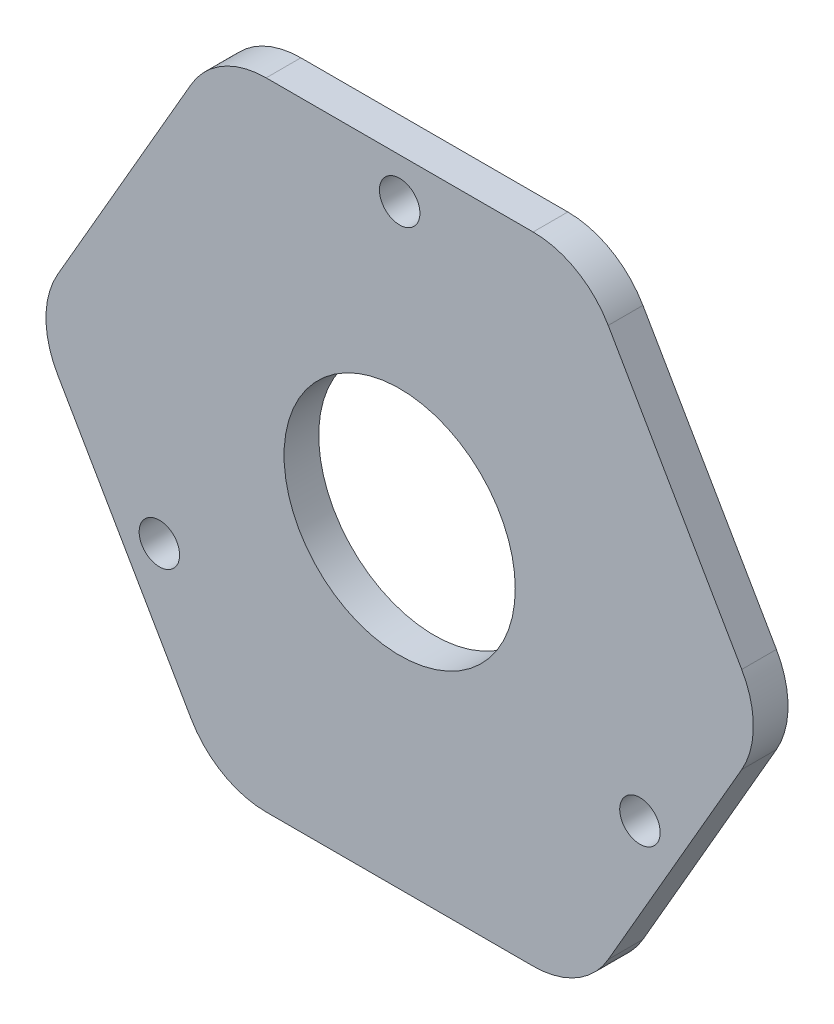
ISO-10303-21;
HEADER;
FILE_DESCRIPTION(('STEP AP214'),'2;1');
FILE_NAME('part.step','',(''),(''),'','','');
FILE_SCHEMA(('AUTOMOTIVE_DESIGN { 1 0 10303 214 1 1 1 1 }'));
ENDSEC;
DATA;
#1=APPLICATION_CONTEXT('core data for automotive mechanical design processes');
#2=APPLICATION_PROTOCOL_DEFINITION('international standard','automotive_design',2000,#1);
#3=PRODUCT_CONTEXT('',#1,'mechanical');
#4=PRODUCT('Part','Part','',(#3));
#5=PRODUCT_RELATED_PRODUCT_CATEGORY('part','',(#4));
#6=PRODUCT_DEFINITION_FORMATION('','',#4);
#7=PRODUCT_DEFINITION_CONTEXT('part definition',#1,'design');
#8=PRODUCT_DEFINITION('design','',#6,#7);
#9=PRODUCT_DEFINITION_SHAPE('','',#8);
#10=(LENGTH_UNIT() NAMED_UNIT(*) SI_UNIT(.MILLI.,.METRE.));
#11=(NAMED_UNIT(*) PLANE_ANGLE_UNIT() SI_UNIT($,.RADIAN.));
#12=(NAMED_UNIT(*) SI_UNIT($,.STERADIAN.) SOLID_ANGLE_UNIT());
#13=UNCERTAINTY_MEASURE_WITH_UNIT(LENGTH_MEASURE(1.E-05),#10,'distance_accuracy_value','');
#14=(GEOMETRIC_REPRESENTATION_CONTEXT(3) GLOBAL_UNCERTAINTY_ASSIGNED_CONTEXT((#13)) GLOBAL_UNIT_ASSIGNED_CONTEXT((#10,
#11,#12)) REPRESENTATION_CONTEXT('',''));
#15=CARTESIAN_POINT('',(0.,0.,0.));
#16=DIRECTION('',(0.,0.,1.));
#17=DIRECTION('',(1.,0.,0.));
#18=AXIS2_PLACEMENT_3D('',#15,#16,#17);
#19=CARTESIAN_POINT('',(-23.094010767585,0.,3.));
#20=DIRECTION('',(0.,0.,1.));
#21=DIRECTION('',(1.,0.,0.));
#22=AXIS2_PLACEMENT_3D('',#19,#20,#21);
#23=PLANE('',#22);
#24=CARTESIAN_POINT('',(-20.7846096908265,-12.,3.));
#25=DIRECTION('',(0.,0.,1.));
#26=DIRECTION('',(1.,0.,0.));
#27=AXIS2_PLACEMENT_3D('',#24,#25,#26);
#28=CIRCLE('',#27,1.75);
#29=CARTESIAN_POINT('',(-19.0346096908265,-12.,3.));
#30=VERTEX_POINT('',#29);
#31=EDGE_CURVE('E293',#30,#30,#28,.T.);
#32=ORIENTED_EDGE('',*,*,#31,.F.);
#33=EDGE_LOOP('',(#32));
#34=FACE_BOUND('',#33,.T.);
#35=CARTESIAN_POINT('',(0.,24.,3.));
#36=DIRECTION('',(0.,0.,1.));
#37=DIRECTION('',(1.,0.,0.));
#38=AXIS2_PLACEMENT_3D('',#35,#36,#37);
#39=CIRCLE('',#38,1.75);
#40=CARTESIAN_POINT('',(1.75,24.,3.));
#41=VERTEX_POINT('',#40);
#42=EDGE_CURVE('E160',#41,#41,#39,.T.);
#43=ORIENTED_EDGE('',*,*,#42,.F.);
#44=EDGE_LOOP('',(#43));
#45=FACE_BOUND('',#44,.T.);
#46=CARTESIAN_POINT('',(-23.094010767585,0.,3.));
#47=DIRECTION('',(0.,0.,1.));
#48=DIRECTION('',(1.,0.,0.));
#49=AXIS2_PLACEMENT_3D('',#46,#47,#48);
#50=CIRCLE('',#49,7.5);
#51=CARTESIAN_POINT('',(-29.5892012959683,3.75000000000003,3.));
#52=VERTEX_POINT('',#51);
#53=CARTESIAN_POINT('',(-29.5892012959683,-3.75000000000004,3.));
#54=VERTEX_POINT('',#53);
#55=EDGE_CURVE('E179',#52,#54,#50,.T.);
#56=ORIENTED_EDGE('',*,*,#55,.T.);
#57=DIRECTION('',(0.5,-0.866025403784439,0.));
#58=VECTOR('',#57,1.);
#59=CARTESIAN_POINT('',(-29.5892012959683,-3.75000000000004,3.));
#60=LINE('',#59,#58);
#61=CARTESIAN_POINT('',(-18.0421959121758,-23.75,3.));
#62=VERTEX_POINT('',#61);
#63=EDGE_CURVE('E107',#54,#62,#60,.T.);
#64=ORIENTED_EDGE('',*,*,#63,.T.);
#65=CARTESIAN_POINT('',(-11.5470053837925,-20.,3.));
#66=DIRECTION('',(0.,0.,1.));
#67=DIRECTION('',(1.,0.,0.));
#68=AXIS2_PLACEMENT_3D('',#65,#66,#67);
#69=CIRCLE('',#68,7.5);
#70=CARTESIAN_POINT('',(-11.5470053837925,-27.5,3.));
#71=VERTEX_POINT('',#70);
#72=EDGE_CURVE('E206',#62,#71,#69,.T.);
#73=ORIENTED_EDGE('',*,*,#72,.T.);
#74=DIRECTION('',(1.,0.,0.));
#75=VECTOR('',#74,1.);
#76=CARTESIAN_POINT('',(-11.5470053837925,-27.5,3.));
#77=LINE('',#76,#75);
#78=CARTESIAN_POINT('',(11.5470053837925,-27.5,3.));
#79=VERTEX_POINT('',#78);
#80=EDGE_CURVE('E225',#71,#79,#77,.T.);
#81=ORIENTED_EDGE('',*,*,#80,.T.);
#82=CARTESIAN_POINT('',(11.5470053837925,-20.,3.));
#83=DIRECTION('',(0.,0.,1.));
#84=DIRECTION('',(1.,0.,0.));
#85=AXIS2_PLACEMENT_3D('',#82,#83,#84);
#86=CIRCLE('',#85,7.5);
#87=CARTESIAN_POINT('',(18.0421959121758,-23.75,3.));
#88=VERTEX_POINT('',#87);
#89=EDGE_CURVE('E222',#79,#88,#86,.T.);
#90=ORIENTED_EDGE('',*,*,#89,.T.);
#91=DIRECTION('',(0.5,0.866025403784438,0.));
#92=VECTOR('',#91,1.);
#93=CARTESIAN_POINT('',(18.0421959121758,-23.75,3.));
#94=LINE('',#93,#92);
#95=CARTESIAN_POINT('',(29.5892012959683,-3.75000000000003,3.));
#96=VERTEX_POINT('',#95);
#97=EDGE_CURVE('E224',#88,#96,#94,.T.);
#98=ORIENTED_EDGE('',*,*,#97,.T.);
#99=CARTESIAN_POINT('',(23.094010767585,0.,3.));
#100=DIRECTION('',(0.,0.,1.));
#101=DIRECTION('',(-1.,0.,0.));
#102=AXIS2_PLACEMENT_3D('',#99,#100,#101);
#103=CIRCLE('',#102,7.5);
#104=CARTESIAN_POINT('',(29.5892012959683,3.75000000000003,3.));
#105=VERTEX_POINT('',#104);
#106=EDGE_CURVE('E227',#96,#105,#103,.T.);
#107=ORIENTED_EDGE('',*,*,#106,.T.);
#108=DIRECTION('',(-0.5,0.866025403784438,0.));
#109=VECTOR('',#108,1.);
#110=CARTESIAN_POINT('',(29.5892012959683,3.75000000000003,3.));
#111=LINE('',#110,#109);
#112=CARTESIAN_POINT('',(18.0421959121758,23.75,3.));
#113=VERTEX_POINT('',#112);
#114=EDGE_CURVE('E233',#105,#113,#111,.T.);
#115=ORIENTED_EDGE('',*,*,#114,.T.);
#116=CARTESIAN_POINT('',(11.5470053837925,20.,3.));
#117=DIRECTION('',(0.,0.,1.));
#118=DIRECTION('',(1.,0.,0.));
#119=AXIS2_PLACEMENT_3D('',#116,#117,#118);
#120=CIRCLE('',#119,7.5);
#121=CARTESIAN_POINT('',(11.5470053837925,27.5,3.));
#122=VERTEX_POINT('',#121);
#123=EDGE_CURVE('E138',#113,#122,#120,.T.);
#124=ORIENTED_EDGE('',*,*,#123,.T.);
#125=DIRECTION('',(-1.,0.,0.));
#126=VECTOR('',#125,1.);
#127=CARTESIAN_POINT('',(11.5470053837925,27.5,3.));
#128=LINE('',#127,#126);
#129=CARTESIAN_POINT('',(-11.5470053837925,27.5,3.));
#130=VERTEX_POINT('',#129);
#131=EDGE_CURVE('E132',#122,#130,#128,.T.);
#132=ORIENTED_EDGE('',*,*,#131,.T.);
#133=CARTESIAN_POINT('',(-11.5470053837925,20.,3.));
#134=DIRECTION('',(0.,0.,1.));
#135=DIRECTION('',(1.,0.,0.));
#136=AXIS2_PLACEMENT_3D('',#133,#134,#135);
#137=CIRCLE('',#136,7.5);
#138=CARTESIAN_POINT('',(-18.0421959121758,23.75,3.));
#139=VERTEX_POINT('',#138);
#140=EDGE_CURVE('E136',#130,#139,#137,.T.);
#141=ORIENTED_EDGE('',*,*,#140,.T.);
#142=DIRECTION('',(-0.5,-0.866025403784438,0.));
#143=VECTOR('',#142,1.);
#144=CARTESIAN_POINT('',(-18.0421959121758,23.75,3.));
#145=LINE('',#144,#143);
#146=EDGE_CURVE('E52',#139,#52,#145,.T.);
#147=ORIENTED_EDGE('',*,*,#146,.T.);
#148=EDGE_LOOP('',(#56,#64,#73,#81,#90,#98,#107,#115,#124,#132,#141,#147));
#149=FACE_BOUND('',#148,.T.);
#150=CARTESIAN_POINT('',(20.7846096908265,-12.,3.));
#151=DIRECTION('',(0.,0.,1.));
#152=DIRECTION('',(1.,0.,0.));
#153=AXIS2_PLACEMENT_3D('',#150,#151,#152);
#154=CIRCLE('',#153,1.75);
#155=CARTESIAN_POINT('',(22.5346096908265,-12.,3.));
#156=VERTEX_POINT('',#155);
#157=EDGE_CURVE('E299',#156,#156,#154,.T.);
#158=ORIENTED_EDGE('',*,*,#157,.F.);
#159=EDGE_LOOP('',(#158));
#160=FACE_BOUND('',#159,.T.);
#161=CARTESIAN_POINT('',(0.,0.,3.));
#162=DIRECTION('',(0.,0.,1.));
#163=DIRECTION('',(1.,0.,0.));
#164=AXIS2_PLACEMENT_3D('',#161,#162,#163);
#165=CIRCLE('',#164,10.);
#166=CARTESIAN_POINT('',(10.,0.,3.));
#167=VERTEX_POINT('',#166);
#168=EDGE_CURVE('E284',#167,#167,#165,.T.);
#169=ORIENTED_EDGE('',*,*,#168,.F.);
#170=EDGE_LOOP('',(#169));
#171=FACE_BOUND('',#170,.T.);
#172=ADVANCED_FACE('F35',(#34,#45,#149,#160,#171),#23,.T.);
#173=CARTESIAN_POINT('',(-23.094010767585,0.,0.));
#174=DIRECTION('',(0.,0.,1.));
#175=DIRECTION('',(1.,0.,0.));
#176=AXIS2_PLACEMENT_3D('',#173,#174,#175);
#177=PLANE('',#176);
#178=CARTESIAN_POINT('',(-23.094010767585,0.,0.));
#179=DIRECTION('',(0.,0.,1.));
#180=DIRECTION('',(1.,0.,0.));
#181=AXIS2_PLACEMENT_3D('',#178,#179,#180);
#182=CIRCLE('',#181,7.5);
#183=CARTESIAN_POINT('',(-29.5892012959683,3.75000000000003,0.));
#184=VERTEX_POINT('',#183);
#185=CARTESIAN_POINT('',(-29.5892012959683,-3.75000000000004,0.));
#186=VERTEX_POINT('',#185);
#187=EDGE_CURVE('E156',#184,#186,#182,.T.);
#188=ORIENTED_EDGE('',*,*,#187,.F.);
#189=DIRECTION('',(-0.5,-0.866025403784438,0.));
#190=VECTOR('',#189,1.);
#191=CARTESIAN_POINT('',(-18.0421959121758,23.75,0.));
#192=LINE('',#191,#190);
#193=CARTESIAN_POINT('',(-18.0421959121758,23.75,0.));
#194=VERTEX_POINT('',#193);
#195=EDGE_CURVE('E99',#194,#184,#192,.T.);
#196=ORIENTED_EDGE('',*,*,#195,.F.);
#197=CARTESIAN_POINT('',(-11.5470053837925,20.,0.));
#198=DIRECTION('',(0.,0.,1.));
#199=DIRECTION('',(1.,0.,0.));
#200=AXIS2_PLACEMENT_3D('',#197,#198,#199);
#201=CIRCLE('',#200,7.5);
#202=CARTESIAN_POINT('',(-11.5470053837925,27.5,0.));
#203=VERTEX_POINT('',#202);
#204=EDGE_CURVE('E93',#203,#194,#201,.T.);
#205=ORIENTED_EDGE('',*,*,#204,.F.);
#206=DIRECTION('',(-1.,0.,0.));
#207=VECTOR('',#206,1.);
#208=CARTESIAN_POINT('',(11.5470053837925,27.5,0.));
#209=LINE('',#208,#207);
#210=CARTESIAN_POINT('',(11.5470053837925,27.5,0.));
#211=VERTEX_POINT('',#210);
#212=EDGE_CURVE('E146',#211,#203,#209,.T.);
#213=ORIENTED_EDGE('',*,*,#212,.F.);
#214=CARTESIAN_POINT('',(11.5470053837925,20.,0.));
#215=DIRECTION('',(0.,0.,1.));
#216=DIRECTION('',(1.,0.,0.));
#217=AXIS2_PLACEMENT_3D('',#214,#215,#216);
#218=CIRCLE('',#217,7.5);
#219=CARTESIAN_POINT('',(18.0421959121758,23.75,0.));
#220=VERTEX_POINT('',#219);
#221=EDGE_CURVE('E174',#220,#211,#218,.T.);
#222=ORIENTED_EDGE('',*,*,#221,.F.);
#223=DIRECTION('',(-0.5,0.866025403784438,0.));
#224=VECTOR('',#223,1.);
#225=CARTESIAN_POINT('',(29.5892012959683,3.75000000000003,0.));
#226=LINE('',#225,#224);
#227=CARTESIAN_POINT('',(29.5892012959683,3.75000000000003,0.));
#228=VERTEX_POINT('',#227);
#229=EDGE_CURVE('E172',#228,#220,#226,.T.);
#230=ORIENTED_EDGE('',*,*,#229,.F.);
#231=CARTESIAN_POINT('',(23.094010767585,0.,0.));
#232=DIRECTION('',(0.,0.,1.));
#233=DIRECTION('',(-1.,0.,0.));
#234=AXIS2_PLACEMENT_3D('',#231,#232,#233);
#235=CIRCLE('',#234,7.5);
#236=CARTESIAN_POINT('',(29.5892012959683,-3.75000000000003,0.));
#237=VERTEX_POINT('',#236);
#238=EDGE_CURVE('E170',#237,#228,#235,.T.);
#239=ORIENTED_EDGE('',*,*,#238,.F.);
#240=DIRECTION('',(0.5,0.866025403784438,0.));
#241=VECTOR('',#240,1.);
#242=CARTESIAN_POINT('',(18.0421959121758,-23.75,0.));
#243=LINE('',#242,#241);
#244=CARTESIAN_POINT('',(18.0421959121758,-23.75,0.));
#245=VERTEX_POINT('',#244);
#246=EDGE_CURVE('E168',#245,#237,#243,.T.);
#247=ORIENTED_EDGE('',*,*,#246,.F.);
#248=CARTESIAN_POINT('',(11.5470053837925,-20.,0.));
#249=DIRECTION('',(0.,0.,1.));
#250=DIRECTION('',(1.,0.,0.));
#251=AXIS2_PLACEMENT_3D('',#248,#249,#250);
#252=CIRCLE('',#251,7.5);
#253=CARTESIAN_POINT('',(11.5470053837925,-27.5,0.));
#254=VERTEX_POINT('',#253);
#255=EDGE_CURVE('E166',#254,#245,#252,.T.);
#256=ORIENTED_EDGE('',*,*,#255,.F.);
#257=DIRECTION('',(1.,0.,0.));
#258=VECTOR('',#257,1.);
#259=CARTESIAN_POINT('',(-11.5470053837925,-27.5,0.));
#260=LINE('',#259,#258);
#261=CARTESIAN_POINT('',(-11.5470053837925,-27.5,0.));
#262=VERTEX_POINT('',#261);
#263=EDGE_CURVE('E164',#262,#254,#260,.T.);
#264=ORIENTED_EDGE('',*,*,#263,.F.);
#265=CARTESIAN_POINT('',(-11.5470053837925,-20.,0.));
#266=DIRECTION('',(0.,0.,1.));
#267=DIRECTION('',(1.,0.,0.));
#268=AXIS2_PLACEMENT_3D('',#265,#266,#267);
#269=CIRCLE('',#268,7.5);
#270=CARTESIAN_POINT('',(-18.0421959121758,-23.75,0.));
#271=VERTEX_POINT('',#270);
#272=EDGE_CURVE('E162',#271,#262,#269,.T.);
#273=ORIENTED_EDGE('',*,*,#272,.F.);
#274=DIRECTION('',(0.5,-0.866025403784439,0.));
#275=VECTOR('',#274,1.);
#276=CARTESIAN_POINT('',(-29.5892012959683,-3.75000000000004,0.));
#277=LINE('',#276,#275);
#278=EDGE_CURVE('E159',#186,#271,#277,.T.);
#279=ORIENTED_EDGE('',*,*,#278,.F.);
#280=EDGE_LOOP('',(#188,#196,#205,#213,#222,#230,#239,#247,#256,#264,#273,#279));
#281=FACE_BOUND('',#280,.T.);
#282=CARTESIAN_POINT('',(0.,24.,0.));
#283=DIRECTION('',(0.,0.,1.));
#284=DIRECTION('',(1.,0.,0.));
#285=AXIS2_PLACEMENT_3D('',#282,#283,#284);
#286=CIRCLE('',#285,1.75);
#287=CARTESIAN_POINT('',(1.75,24.,0.));
#288=VERTEX_POINT('',#287);
#289=EDGE_CURVE('E302',#288,#288,#286,.T.);
#290=ORIENTED_EDGE('',*,*,#289,.T.);
#291=EDGE_LOOP('',(#290));
#292=FACE_BOUND('',#291,.T.);
#293=CARTESIAN_POINT('',(20.7846096908265,-12.,0.));
#294=DIRECTION('',(0.,0.,1.));
#295=DIRECTION('',(1.,0.,0.));
#296=AXIS2_PLACEMENT_3D('',#293,#294,#295);
#297=CIRCLE('',#296,1.75);
#298=CARTESIAN_POINT('',(22.5346096908265,-12.,0.));
#299=VERTEX_POINT('',#298);
#300=EDGE_CURVE('E296',#299,#299,#297,.T.);
#301=ORIENTED_EDGE('',*,*,#300,.T.);
#302=EDGE_LOOP('',(#301));
#303=FACE_BOUND('',#302,.T.);
#304=CARTESIAN_POINT('',(-20.7846096908265,-12.,0.));
#305=DIRECTION('',(0.,0.,1.));
#306=DIRECTION('',(1.,0.,0.));
#307=AXIS2_PLACEMENT_3D('',#304,#305,#306);
#308=CIRCLE('',#307,1.75);
#309=CARTESIAN_POINT('',(-19.0346096908265,-12.,0.));
#310=VERTEX_POINT('',#309);
#311=EDGE_CURVE('E290',#310,#310,#308,.T.);
#312=ORIENTED_EDGE('',*,*,#311,.T.);
#313=EDGE_LOOP('',(#312));
#314=FACE_BOUND('',#313,.T.);
#315=CARTESIAN_POINT('',(0.,0.,0.));
#316=DIRECTION('',(0.,0.,1.));
#317=DIRECTION('',(1.,0.,0.));
#318=AXIS2_PLACEMENT_3D('',#315,#316,#317);
#319=CIRCLE('',#318,10.);
#320=CARTESIAN_POINT('',(10.,0.,0.));
#321=VERTEX_POINT('',#320);
#322=EDGE_CURVE('E287',#321,#321,#319,.T.);
#323=ORIENTED_EDGE('',*,*,#322,.T.);
#324=EDGE_LOOP('',(#323));
#325=FACE_BOUND('',#324,.T.);
#326=ADVANCED_FACE('F210',(#281,#292,#303,#314,#325),#177,.F.);
#327=CARTESIAN_POINT('',(-23.094010767585,0.,3.));
#328=DIRECTION('',(0.,0.,-1.));
#329=DIRECTION('',(-1.,0.,0.));
#330=AXIS2_PLACEMENT_3D('',#327,#328,#329);
#331=CYLINDRICAL_SURFACE('',#330,7.5);
#332=ORIENTED_EDGE('',*,*,#187,.T.);
#333=DIRECTION('',(0.,0.,-1.));
#334=VECTOR('',#333,1.);
#335=CARTESIAN_POINT('',(-29.5892012959683,-3.75000000000004,3.));
#336=LINE('',#335,#334);
#337=EDGE_CURVE('E11',#54,#186,#336,.T.);
#338=ORIENTED_EDGE('',*,*,#337,.F.);
#339=ORIENTED_EDGE('',*,*,#55,.F.);
#340=DIRECTION('',(0.,0.,-1.));
#341=VECTOR('',#340,1.);
#342=CARTESIAN_POINT('',(-29.5892012959683,3.75000000000003,3.));
#343=LINE('',#342,#341);
#344=EDGE_CURVE('E152',#52,#184,#343,.T.);
#345=ORIENTED_EDGE('',*,*,#344,.T.);
#346=EDGE_LOOP('',(#332,#338,#339,#345));
#347=FACE_BOUND('',#346,.T.);
#348=ADVANCED_FACE('F37',(#347),#331,.T.);
#349=CARTESIAN_POINT('',(-29.5892012959683,-3.75000000000004,3.));
#350=DIRECTION('',(0.866025403784438,0.5,0.));
#351=DIRECTION('',(-0.5,0.866025403784439,0.));
#352=AXIS2_PLACEMENT_3D('',#349,#350,#351);
#353=PLANE('',#352);
#354=ORIENTED_EDGE('',*,*,#278,.T.);
#355=DIRECTION('',(0.,0.,-1.));
#356=VECTOR('',#355,1.);
#357=CARTESIAN_POINT('',(-18.0421959121758,-23.75,3.));
#358=LINE('',#357,#356);
#359=EDGE_CURVE('E44',#62,#271,#358,.T.);
#360=ORIENTED_EDGE('',*,*,#359,.F.);
#361=ORIENTED_EDGE('',*,*,#63,.F.);
#362=ORIENTED_EDGE('',*,*,#337,.T.);
#363=EDGE_LOOP('',(#354,#360,#361,#362));
#364=FACE_BOUND('',#363,.T.);
#365=ADVANCED_FACE('F412',(#364),#353,.F.);
#366=CARTESIAN_POINT('',(-11.5470053837925,-20.,3.));
#367=DIRECTION('',(0.,0.,-1.));
#368=DIRECTION('',(-1.,0.,0.));
#369=AXIS2_PLACEMENT_3D('',#366,#367,#368);
#370=CYLINDRICAL_SURFACE('',#369,7.5);
#371=ORIENTED_EDGE('',*,*,#272,.T.);
#372=DIRECTION('',(0.,0.,-1.));
#373=VECTOR('',#372,1.);
#374=CARTESIAN_POINT('',(-11.5470053837925,-27.5,3.));
#375=LINE('',#374,#373);
#376=EDGE_CURVE('E198',#71,#262,#375,.T.);
#377=ORIENTED_EDGE('',*,*,#376,.F.);
#378=ORIENTED_EDGE('',*,*,#72,.F.);
#379=ORIENTED_EDGE('',*,*,#359,.T.);
#380=EDGE_LOOP('',(#371,#377,#378,#379));
#381=FACE_BOUND('',#380,.T.);
#382=ADVANCED_FACE('F204',(#381),#370,.T.);
#383=CARTESIAN_POINT('',(-11.5470053837925,-27.5,3.));
#384=DIRECTION('',(0.,1.,0.));
#385=DIRECTION('',(0.,0.,1.));
#386=AXIS2_PLACEMENT_3D('',#383,#384,#385);
#387=PLANE('',#386);
#388=ORIENTED_EDGE('',*,*,#263,.T.);
#389=DIRECTION('',(0.,0.,-1.));
#390=VECTOR('',#389,1.);
#391=CARTESIAN_POINT('',(11.5470053837925,-27.5,3.));
#392=LINE('',#391,#390);
#393=EDGE_CURVE('E195',#79,#254,#392,.T.);
#394=ORIENTED_EDGE('',*,*,#393,.F.);
#395=ORIENTED_EDGE('',*,*,#80,.F.);
#396=ORIENTED_EDGE('',*,*,#376,.T.);
#397=EDGE_LOOP('',(#388,#394,#395,#396));
#398=FACE_BOUND('',#397,.T.);
#399=ADVANCED_FACE('F216',(#398),#387,.F.);
#400=CARTESIAN_POINT('',(11.5470053837925,-20.,3.));
#401=DIRECTION('',(0.,0.,-1.));
#402=DIRECTION('',(-1.,0.,0.));
#403=AXIS2_PLACEMENT_3D('',#400,#401,#402);
#404=CYLINDRICAL_SURFACE('',#403,7.5);
#405=ORIENTED_EDGE('',*,*,#255,.T.);
#406=DIRECTION('',(0.,0.,-1.));
#407=VECTOR('',#406,1.);
#408=CARTESIAN_POINT('',(18.0421959121758,-23.75,3.));
#409=LINE('',#408,#407);
#410=EDGE_CURVE('E192',#88,#245,#409,.T.);
#411=ORIENTED_EDGE('',*,*,#410,.F.);
#412=ORIENTED_EDGE('',*,*,#89,.F.);
#413=ORIENTED_EDGE('',*,*,#393,.T.);
#414=EDGE_LOOP('',(#405,#411,#412,#413));
#415=FACE_BOUND('',#414,.T.);
#416=ADVANCED_FACE('F220',(#415),#404,.T.);
#417=CARTESIAN_POINT('',(18.0421959121758,-23.75,3.));
#418=DIRECTION('',(-0.866025403784439,0.5,0.));
#419=DIRECTION('',(-0.5,-0.866025403784439,0.));
#420=AXIS2_PLACEMENT_3D('',#417,#418,#419);
#421=PLANE('',#420);
#422=ORIENTED_EDGE('',*,*,#246,.T.);
#423=DIRECTION('',(0.,0.,-1.));
#424=VECTOR('',#423,1.);
#425=CARTESIAN_POINT('',(29.5892012959683,-3.75000000000003,3.));
#426=LINE('',#425,#424);
#427=EDGE_CURVE('E189',#96,#237,#426,.T.);
#428=ORIENTED_EDGE('',*,*,#427,.F.);
#429=ORIENTED_EDGE('',*,*,#97,.F.);
#430=ORIENTED_EDGE('',*,*,#410,.T.);
#431=EDGE_LOOP('',(#422,#428,#429,#430));
#432=FACE_BOUND('',#431,.T.);
#433=ADVANCED_FACE('F377',(#432),#421,.F.);
#434=CARTESIAN_POINT('',(23.094010767585,0.,3.));
#435=DIRECTION('',(0.,0.,-1.));
#436=DIRECTION('',(-1.,0.,0.));
#437=AXIS2_PLACEMENT_3D('',#434,#435,#436);
#438=CYLINDRICAL_SURFACE('',#437,7.5);
#439=ORIENTED_EDGE('',*,*,#238,.T.);
#440=DIRECTION('',(0.,0.,-1.));
#441=VECTOR('',#440,1.);
#442=CARTESIAN_POINT('',(29.5892012959683,3.75000000000003,3.));
#443=LINE('',#442,#441);
#444=EDGE_CURVE('E186',#105,#228,#443,.T.);
#445=ORIENTED_EDGE('',*,*,#444,.F.);
#446=ORIENTED_EDGE('',*,*,#106,.F.);
#447=ORIENTED_EDGE('',*,*,#427,.T.);
#448=EDGE_LOOP('',(#439,#445,#446,#447));
#449=FACE_BOUND('',#448,.T.);
#450=ADVANCED_FACE('F368',(#449),#438,.T.);
#451=CARTESIAN_POINT('',(29.5892012959683,3.75000000000003,3.));
#452=DIRECTION('',(-0.866025403784439,-0.5,0.));
#453=DIRECTION('',(0.5,-0.866025403784439,0.));
#454=AXIS2_PLACEMENT_3D('',#451,#452,#453);
#455=PLANE('',#454);
#456=ORIENTED_EDGE('',*,*,#229,.T.);
#457=DIRECTION('',(0.,0.,-1.));
#458=VECTOR('',#457,1.);
#459=CARTESIAN_POINT('',(18.0421959121758,23.75,3.));
#460=LINE('',#459,#458);
#461=EDGE_CURVE('E183',#113,#220,#460,.T.);
#462=ORIENTED_EDGE('',*,*,#461,.F.);
#463=ORIENTED_EDGE('',*,*,#114,.F.);
#464=ORIENTED_EDGE('',*,*,#444,.T.);
#465=EDGE_LOOP('',(#456,#462,#463,#464));
#466=FACE_BOUND('',#465,.T.);
#467=ADVANCED_FACE('F239',(#466),#455,.F.);
#468=CARTESIAN_POINT('',(11.5470053837925,20.,3.));
#469=DIRECTION('',(0.,0.,-1.));
#470=DIRECTION('',(-1.,0.,0.));
#471=AXIS2_PLACEMENT_3D('',#468,#469,#470);
#472=CYLINDRICAL_SURFACE('',#471,7.5);
#473=ORIENTED_EDGE('',*,*,#221,.T.);
#474=DIRECTION('',(0.,0.,-1.));
#475=VECTOR('',#474,1.);
#476=CARTESIAN_POINT('',(11.5470053837925,27.5,3.));
#477=LINE('',#476,#475);
#478=EDGE_CURVE('E147',#122,#211,#477,.T.);
#479=ORIENTED_EDGE('',*,*,#478,.F.);
#480=ORIENTED_EDGE('',*,*,#123,.F.);
#481=ORIENTED_EDGE('',*,*,#461,.T.);
#482=EDGE_LOOP('',(#473,#479,#480,#481));
#483=FACE_BOUND('',#482,.T.);
#484=ADVANCED_FACE('F243',(#483),#472,.T.);
#485=CARTESIAN_POINT('',(11.5470053837925,27.5,3.));
#486=DIRECTION('',(0.,-1.,0.));
#487=DIRECTION('',(0.,0.,-1.));
#488=AXIS2_PLACEMENT_3D('',#485,#486,#487);
#489=PLANE('',#488);
#490=ORIENTED_EDGE('',*,*,#212,.T.);
#491=DIRECTION('',(0.,0.,-1.));
#492=VECTOR('',#491,1.);
#493=CARTESIAN_POINT('',(-11.5470053837925,27.5,3.));
#494=LINE('',#493,#492);
#495=EDGE_CURVE('E143',#130,#203,#494,.T.);
#496=ORIENTED_EDGE('',*,*,#495,.F.);
#497=ORIENTED_EDGE('',*,*,#131,.F.);
#498=ORIENTED_EDGE('',*,*,#478,.T.);
#499=EDGE_LOOP('',(#490,#496,#497,#498));
#500=FACE_BOUND('',#499,.T.);
#501=ADVANCED_FACE('F144',(#500),#489,.F.);
#502=CARTESIAN_POINT('',(-11.5470053837925,20.,3.));
#503=DIRECTION('',(0.,0.,-1.));
#504=DIRECTION('',(-1.,0.,0.));
#505=AXIS2_PLACEMENT_3D('',#502,#503,#504);
#506=CYLINDRICAL_SURFACE('',#505,7.5);
#507=ORIENTED_EDGE('',*,*,#204,.T.);
#508=DIRECTION('',(0.,0.,-1.));
#509=VECTOR('',#508,1.);
#510=CARTESIAN_POINT('',(-18.0421959121758,23.75,3.));
#511=LINE('',#510,#509);
#512=EDGE_CURVE('E148',#139,#194,#511,.T.);
#513=ORIENTED_EDGE('',*,*,#512,.F.);
#514=ORIENTED_EDGE('',*,*,#140,.F.);
#515=ORIENTED_EDGE('',*,*,#495,.T.);
#516=EDGE_LOOP('',(#507,#513,#514,#515));
#517=FACE_BOUND('',#516,.T.);
#518=ADVANCED_FACE('F150',(#517),#506,.T.);
#519=CARTESIAN_POINT('',(-18.0421959121758,23.75,3.));
#520=DIRECTION('',(0.866025403784439,-0.5,0.));
#521=DIRECTION('',(0.5,0.866025403784439,0.));
#522=AXIS2_PLACEMENT_3D('',#519,#520,#521);
#523=PLANE('',#522);
#524=ORIENTED_EDGE('',*,*,#195,.T.);
#525=ORIENTED_EDGE('',*,*,#344,.F.);
#526=ORIENTED_EDGE('',*,*,#146,.F.);
#527=ORIENTED_EDGE('',*,*,#512,.T.);
#528=EDGE_LOOP('',(#524,#525,#526,#527));
#529=FACE_BOUND('',#528,.T.);
#530=ADVANCED_FACE('F247',(#529),#523,.F.);
#531=CARTESIAN_POINT('',(0.,24.,3.));
#532=DIRECTION('',(0.,0.,-1.));
#533=DIRECTION('',(-1.,0.,0.));
#534=AXIS2_PLACEMENT_3D('',#531,#532,#533);
#535=CYLINDRICAL_SURFACE('',#534,1.75);
#536=ORIENTED_EDGE('',*,*,#42,.T.);
#537=EDGE_LOOP('',(#536));
#538=FACE_BOUND('',#537,.T.);
#539=ORIENTED_EDGE('',*,*,#289,.F.);
#540=EDGE_LOOP('',(#539));
#541=FACE_BOUND('',#540,.T.);
#542=ADVANCED_FACE('F249',(#538,#541),#535,.F.);
#543=CARTESIAN_POINT('',(20.7846096908265,-12.,3.));
#544=DIRECTION('',(0.,0.,-1.));
#545=DIRECTION('',(-1.,0.,0.));
#546=AXIS2_PLACEMENT_3D('',#543,#544,#545);
#547=CYLINDRICAL_SURFACE('',#546,1.75);
#548=ORIENTED_EDGE('',*,*,#157,.T.);
#549=EDGE_LOOP('',(#548));
#550=FACE_BOUND('',#549,.T.);
#551=ORIENTED_EDGE('',*,*,#300,.F.);
#552=EDGE_LOOP('',(#551));
#553=FACE_BOUND('',#552,.T.);
#554=ADVANCED_FACE('F255',(#550,#553),#547,.F.);
#555=CARTESIAN_POINT('',(-20.7846096908265,-12.,3.));
#556=DIRECTION('',(0.,0.,-1.));
#557=DIRECTION('',(-1.,0.,0.));
#558=AXIS2_PLACEMENT_3D('',#555,#556,#557);
#559=CYLINDRICAL_SURFACE('',#558,1.75);
#560=ORIENTED_EDGE('',*,*,#31,.T.);
#561=EDGE_LOOP('',(#560));
#562=FACE_BOUND('',#561,.T.);
#563=ORIENTED_EDGE('',*,*,#311,.F.);
#564=EDGE_LOOP('',(#563));
#565=FACE_BOUND('',#564,.T.);
#566=ADVANCED_FACE('F271',(#562,#565),#559,.F.);
#567=CARTESIAN_POINT('',(0.,0.,3.));
#568=DIRECTION('',(0.,0.,-1.));
#569=DIRECTION('',(-1.,0.,0.));
#570=AXIS2_PLACEMENT_3D('',#567,#568,#569);
#571=CYLINDRICAL_SURFACE('',#570,10.);
#572=ORIENTED_EDGE('',*,*,#168,.T.);
#573=EDGE_LOOP('',(#572));
#574=FACE_BOUND('',#573,.T.);
#575=ORIENTED_EDGE('',*,*,#322,.F.);
#576=EDGE_LOOP('',(#575));
#577=FACE_BOUND('',#576,.T.);
#578=ADVANCED_FACE('F275',(#574,#577),#571,.F.);
#579=CLOSED_SHELL('',(#172,#326,#348,#365,#382,#399,#416,#433,#450,#467,#484,#501,#518,#530,
#542,#554,#566,#578));
#580=MANIFOLD_SOLID_BREP('B2',#579);
#581=ADVANCED_BREP_SHAPE_REPRESENTATION('',(#18,#580),#14);
#582=SHAPE_DEFINITION_REPRESENTATION(#9,#581);
ENDSEC;
END-ISO-10303-21;
